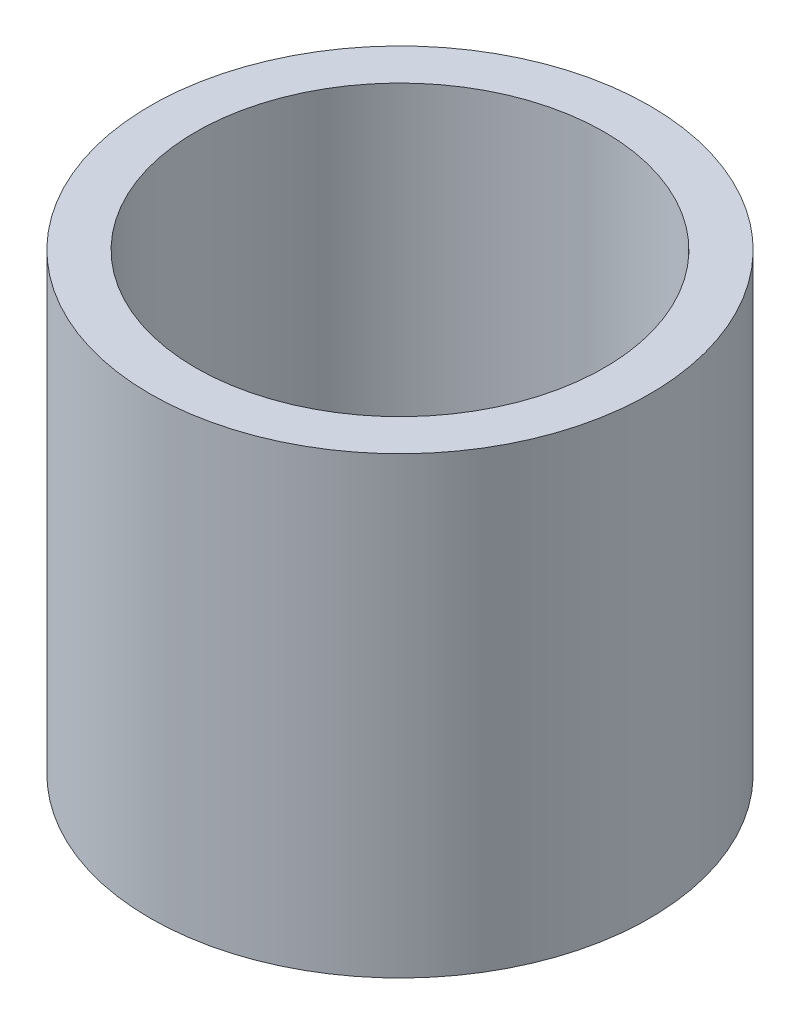
ISO-10303-21;
HEADER;
FILE_DESCRIPTION(('STEP AP214'),'2;1');
FILE_NAME('part.step','',(''),(''),'','','');
FILE_SCHEMA(('AUTOMOTIVE_DESIGN { 1 0 10303 214 1 1 1 1 }'));
ENDSEC;
DATA;
#1=APPLICATION_CONTEXT('core data for automotive mechanical design processes');
#2=APPLICATION_PROTOCOL_DEFINITION('international standard','automotive_design',2000,#1);
#3=PRODUCT_CONTEXT('',#1,'mechanical');
#4=PRODUCT('Part','Part','',(#3));
#5=PRODUCT_RELATED_PRODUCT_CATEGORY('part','',(#4));
#6=PRODUCT_DEFINITION_FORMATION('','',#4);
#7=PRODUCT_DEFINITION_CONTEXT('part definition',#1,'design');
#8=PRODUCT_DEFINITION('design','',#6,#7);
#9=PRODUCT_DEFINITION_SHAPE('','',#8);
#10=(LENGTH_UNIT() NAMED_UNIT(*) SI_UNIT(.MILLI.,.METRE.));
#11=(NAMED_UNIT(*) PLANE_ANGLE_UNIT() SI_UNIT($,.RADIAN.));
#12=(NAMED_UNIT(*) SI_UNIT($,.STERADIAN.) SOLID_ANGLE_UNIT());
#13=UNCERTAINTY_MEASURE_WITH_UNIT(LENGTH_MEASURE(1.E-05),#10,'distance_accuracy_value','');
#14=(GEOMETRIC_REPRESENTATION_CONTEXT(3) GLOBAL_UNCERTAINTY_ASSIGNED_CONTEXT((#13)) GLOBAL_UNIT_ASSIGNED_CONTEXT((#10,
#11,#12)) REPRESENTATION_CONTEXT('',''));
#15=CARTESIAN_POINT('',(0.,0.,0.));
#16=DIRECTION('',(0.,0.,1.));
#17=DIRECTION('',(1.,0.,0.));
#18=AXIS2_PLACEMENT_3D('',#15,#16,#17);
#19=CARTESIAN_POINT('',(0.,5.,0.));
#20=DIRECTION('',(0.,1.,0.));
#21=DIRECTION('',(0.,0.,1.));
#22=AXIS2_PLACEMENT_3D('',#19,#20,#21);
#23=PLANE('',#22);
#24=CARTESIAN_POINT('',(0.,5.,0.));
#25=DIRECTION('',(0.,1.,0.));
#26=DIRECTION('',(0.,0.,1.));
#27=AXIS2_PLACEMENT_3D('',#24,#25,#26);
#28=CIRCLE('',#27,2.75);
#29=CARTESIAN_POINT('',(0.,5.,2.75));
#30=VERTEX_POINT('',#29);
#31=EDGE_CURVE('E10',#30,#30,#28,.T.);
#32=ORIENTED_EDGE('',*,*,#31,.T.);
#33=EDGE_LOOP('',(#32));
#34=FACE_BOUND('',#33,.T.);
#35=CARTESIAN_POINT('',(0.,5.,0.));
#36=DIRECTION('',(0.,1.,0.));
#37=DIRECTION('',(0.,0.,1.));
#38=AXIS2_PLACEMENT_3D('',#35,#36,#37);
#39=CIRCLE('',#38,2.25);
#40=CARTESIAN_POINT('',(0.,5.,2.25));
#41=VERTEX_POINT('',#40);
#42=EDGE_CURVE('E45',#41,#41,#39,.T.);
#43=ORIENTED_EDGE('',*,*,#42,.F.);
#44=EDGE_LOOP('',(#43));
#45=FACE_BOUND('',#44,.T.);
#46=ADVANCED_FACE('F34',(#34,#45),#23,.T.);
#47=CARTESIAN_POINT('',(0.,0.,0.));
#48=DIRECTION('',(0.,1.,0.));
#49=DIRECTION('',(0.,0.,1.));
#50=AXIS2_PLACEMENT_3D('',#47,#48,#49);
#51=PLANE('',#50);
#52=CARTESIAN_POINT('',(0.,0.,0.));
#53=DIRECTION('',(0.,1.,0.));
#54=DIRECTION('',(0.,0.,1.));
#55=AXIS2_PLACEMENT_3D('',#52,#53,#54);
#56=CIRCLE('',#55,2.75);
#57=CARTESIAN_POINT('',(0.,0.,2.75));
#58=VERTEX_POINT('',#57);
#59=EDGE_CURVE('E38',#58,#58,#56,.T.);
#60=ORIENTED_EDGE('',*,*,#59,.F.);
#61=EDGE_LOOP('',(#60));
#62=FACE_BOUND('',#61,.T.);
#63=CARTESIAN_POINT('',(0.,0.,0.));
#64=DIRECTION('',(0.,1.,0.));
#65=DIRECTION('',(0.,0.,1.));
#66=AXIS2_PLACEMENT_3D('',#63,#64,#65);
#67=CIRCLE('',#66,2.25);
#68=CARTESIAN_POINT('',(0.,0.,2.25));
#69=VERTEX_POINT('',#68);
#70=EDGE_CURVE('E47',#69,#69,#67,.T.);
#71=ORIENTED_EDGE('',*,*,#70,.T.);
#72=EDGE_LOOP('',(#71));
#73=FACE_BOUND('',#72,.T.);
#74=ADVANCED_FACE('F57',(#62,#73),#51,.F.);
#75=CARTESIAN_POINT('',(0.,5.,0.));
#76=DIRECTION('',(0.,-1.,0.));
#77=DIRECTION('',(0.,0.,-1.));
#78=AXIS2_PLACEMENT_3D('',#75,#76,#77);
#79=CYLINDRICAL_SURFACE('',#78,2.75);
#80=ORIENTED_EDGE('',*,*,#31,.F.);
#81=EDGE_LOOP('',(#80));
#82=FACE_BOUND('',#81,.T.);
#83=ORIENTED_EDGE('',*,*,#59,.T.);
#84=EDGE_LOOP('',(#83));
#85=FACE_BOUND('',#84,.T.);
#86=ADVANCED_FACE('F36',(#82,#85),#79,.T.);
#87=CARTESIAN_POINT('',(0.,5.,0.));
#88=DIRECTION('',(0.,-1.,0.));
#89=DIRECTION('',(0.,0.,-1.));
#90=AXIS2_PLACEMENT_3D('',#87,#88,#89);
#91=CYLINDRICAL_SURFACE('',#90,2.25);
#92=ORIENTED_EDGE('',*,*,#42,.T.);
#93=EDGE_LOOP('',(#92));
#94=FACE_BOUND('',#93,.T.);
#95=ORIENTED_EDGE('',*,*,#70,.F.);
#96=EDGE_LOOP('',(#95));
#97=FACE_BOUND('',#96,.T.);
#98=ADVANCED_FACE('F53',(#94,#97),#91,.F.);
#99=CLOSED_SHELL('',(#46,#74,#86,#98));
#100=MANIFOLD_SOLID_BREP('B2',#99);
#101=ADVANCED_BREP_SHAPE_REPRESENTATION('',(#18,#100),#14);
#102=SHAPE_DEFINITION_REPRESENTATION(#9,#101);
ENDSEC;
END-ISO-10303-21;
